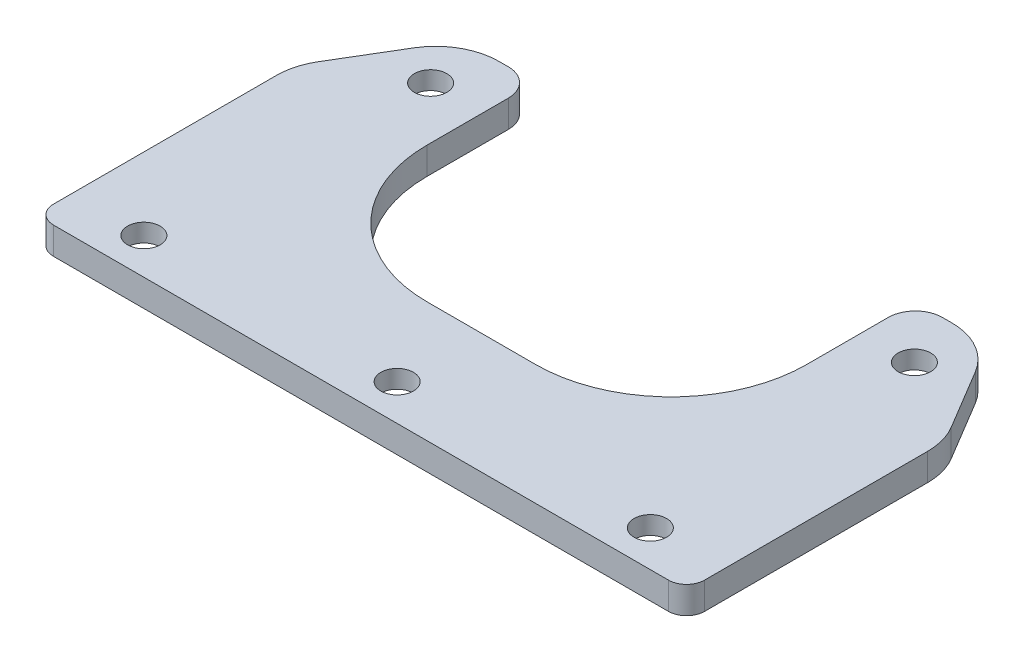
ISO-10303-21;
HEADER;
FILE_DESCRIPTION(('STEP AP214'),'2;1');
FILE_NAME('part.step','',(''),(''),'','','');
FILE_SCHEMA(('AUTOMOTIVE_DESIGN { 1 0 10303 214 1 1 1 1 }'));
ENDSEC;
DATA;
#1=APPLICATION_CONTEXT('core data for automotive mechanical design processes');
#2=APPLICATION_PROTOCOL_DEFINITION('international standard','automotive_design',2000,#1);
#3=PRODUCT_CONTEXT('',#1,'mechanical');
#4=PRODUCT('Part','Part','',(#3));
#5=PRODUCT_RELATED_PRODUCT_CATEGORY('part','',(#4));
#6=PRODUCT_DEFINITION_FORMATION('','',#4);
#7=PRODUCT_DEFINITION_CONTEXT('part definition',#1,'design');
#8=PRODUCT_DEFINITION('design','',#6,#7);
#9=PRODUCT_DEFINITION_SHAPE('','',#8);
#10=(LENGTH_UNIT() NAMED_UNIT(*) SI_UNIT(.MILLI.,.METRE.));
#11=(NAMED_UNIT(*) PLANE_ANGLE_UNIT() SI_UNIT($,.RADIAN.));
#12=(NAMED_UNIT(*) SI_UNIT($,.STERADIAN.) SOLID_ANGLE_UNIT());
#13=UNCERTAINTY_MEASURE_WITH_UNIT(LENGTH_MEASURE(1.E-05),#10,'distance_accuracy_value','');
#14=(GEOMETRIC_REPRESENTATION_CONTEXT(3) GLOBAL_UNCERTAINTY_ASSIGNED_CONTEXT((#13)) GLOBAL_UNIT_ASSIGNED_CONTEXT((#10,
#11,#12)) REPRESENTATION_CONTEXT('',''));
#15=CARTESIAN_POINT('',(0.,0.,0.));
#16=DIRECTION('',(0.,0.,1.));
#17=DIRECTION('',(1.,0.,0.));
#18=AXIS2_PLACEMENT_3D('',#15,#16,#17);
#19=CARTESIAN_POINT('',(-242.879921715151,3.,-77.4282939240285));
#20=DIRECTION('',(0.,-1.,0.));
#21=DIRECTION('',(0.,0.,-1.));
#22=AXIS2_PLACEMENT_3D('',#19,#20,#21);
#23=CYLINDRICAL_SURFACE('',#22,1.80000000000001);
#24=CARTESIAN_POINT('',(-242.879921715151,-22.,-77.4282939240285));
#25=DIRECTION('',(0.,-1.,0.));
#26=DIRECTION('',(0.,0.,-1.));
#27=AXIS2_PLACEMENT_3D('',#24,#25,#26);
#28=CIRCLE('',#27,1.80000000000001);
#29=CARTESIAN_POINT('',(-242.879921715151,-22.,-79.2282939240285));
#30=VERTEX_POINT('',#29);
#31=EDGE_CURVE('E40',#30,#30,#28,.T.);
#32=ORIENTED_EDGE('',*,*,#31,.T.);
#33=EDGE_LOOP('',(#32));
#34=FACE_BOUND('',#33,.T.);
#35=CARTESIAN_POINT('',(-242.879921715151,-20.,-77.4282939240285));
#36=DIRECTION('',(0.,1.,0.));
#37=DIRECTION('',(0.,0.,1.));
#38=AXIS2_PLACEMENT_3D('',#35,#36,#37);
#39=CIRCLE('',#38,1.80000000000001);
#40=CARTESIAN_POINT('',(-242.879921715151,-20.,-75.6282939240285));
#41=VERTEX_POINT('',#40);
#42=EDGE_CURVE('E440',#41,#41,#39,.T.);
#43=ORIENTED_EDGE('',*,*,#42,.T.);
#44=EDGE_LOOP('',(#43));
#45=FACE_BOUND('',#44,.T.);
#46=ADVANCED_FACE('F36',(#34,#45),#23,.F.);
#47=CARTESIAN_POINT('',(-270.879921715153,3.,-77.4282939240285));
#48=DIRECTION('',(0.,-1.,0.));
#49=DIRECTION('',(0.,0.,-1.));
#50=AXIS2_PLACEMENT_3D('',#47,#48,#49);
#51=CYLINDRICAL_SURFACE('',#50,1.80000000000001);
#52=CARTESIAN_POINT('',(-270.879921715153,-22.,-77.4282939240285));
#53=DIRECTION('',(0.,-1.,0.));
#54=DIRECTION('',(0.,0.,-1.));
#55=AXIS2_PLACEMENT_3D('',#52,#53,#54);
#56=CIRCLE('',#55,1.80000000000001);
#57=CARTESIAN_POINT('',(-270.879921715153,-22.,-79.2282939240285));
#58=VERTEX_POINT('',#57);
#59=EDGE_CURVE('E239',#58,#58,#56,.T.);
#60=ORIENTED_EDGE('',*,*,#59,.T.);
#61=EDGE_LOOP('',(#60));
#62=FACE_BOUND('',#61,.T.);
#63=CARTESIAN_POINT('',(-270.879921715153,-20.,-77.4282939240285));
#64=DIRECTION('',(0.,1.,0.));
#65=DIRECTION('',(0.,0.,1.));
#66=AXIS2_PLACEMENT_3D('',#63,#64,#65);
#67=CIRCLE('',#66,1.80000000000001);
#68=CARTESIAN_POINT('',(-270.879921715153,-20.,-75.6282939240285));
#69=VERTEX_POINT('',#68);
#70=EDGE_CURVE('E437',#69,#69,#67,.T.);
#71=ORIENTED_EDGE('',*,*,#70,.T.);
#72=EDGE_LOOP('',(#71));
#73=FACE_BOUND('',#72,.T.);
#74=ADVANCED_FACE('F482',(#62,#73),#51,.F.);
#75=CARTESIAN_POINT('',(-216.129921715153,3.,-107.878293924028));
#76=DIRECTION('',(0.,-1.,0.));
#77=DIRECTION('',(0.,0.,-1.));
#78=AXIS2_PLACEMENT_3D('',#75,#76,#77);
#79=CYLINDRICAL_SURFACE('',#78,1.80000000000001);
#80=CARTESIAN_POINT('',(-216.129921715153,-22.,-107.878293924028));
#81=DIRECTION('',(0.,-1.,0.));
#82=DIRECTION('',(0.,0.,-1.));
#83=AXIS2_PLACEMENT_3D('',#80,#81,#82);
#84=CIRCLE('',#83,1.80000000000001);
#85=CARTESIAN_POINT('',(-216.129921715153,-22.,-109.678293924028));
#86=VERTEX_POINT('',#85);
#87=EDGE_CURVE('E236',#86,#86,#84,.F.);
#88=ORIENTED_EDGE('',*,*,#87,.F.);
#89=EDGE_LOOP('',(#88));
#90=FACE_BOUND('',#89,.T.);
#91=CARTESIAN_POINT('',(-216.129921715153,-20.,-107.878293924028));
#92=DIRECTION('',(0.,1.,0.));
#93=DIRECTION('',(0.,0.,1.));
#94=AXIS2_PLACEMENT_3D('',#91,#92,#93);
#95=CIRCLE('',#94,1.80000000000001);
#96=CARTESIAN_POINT('',(-216.129921715153,-20.,-106.078293924028));
#97=VERTEX_POINT('',#96);
#98=EDGE_CURVE('E434',#97,#97,#95,.F.);
#99=ORIENTED_EDGE('',*,*,#98,.F.);
#100=EDGE_LOOP('',(#99));
#101=FACE_BOUND('',#100,.T.);
#102=ADVANCED_FACE('F487',(#90,#101),#79,.F.);
#103=CARTESIAN_POINT('',(-214.879921715153,3.,-77.4282939240285));
#104=DIRECTION('',(0.,-1.,0.));
#105=DIRECTION('',(0.,0.,-1.));
#106=AXIS2_PLACEMENT_3D('',#103,#104,#105);
#107=CYLINDRICAL_SURFACE('',#106,1.80000000000001);
#108=CARTESIAN_POINT('',(-214.879921715153,-22.,-77.4282939240285));
#109=DIRECTION('',(0.,-1.,0.));
#110=DIRECTION('',(0.,0.,-1.));
#111=AXIS2_PLACEMENT_3D('',#108,#109,#110);
#112=CIRCLE('',#111,1.80000000000001);
#113=CARTESIAN_POINT('',(-214.879921715153,-22.,-79.2282939240285));
#114=VERTEX_POINT('',#113);
#115=EDGE_CURVE('E233',#114,#114,#112,.F.);
#116=ORIENTED_EDGE('',*,*,#115,.F.);
#117=EDGE_LOOP('',(#116));
#118=FACE_BOUND('',#117,.T.);
#119=CARTESIAN_POINT('',(-214.879921715153,-20.,-77.4282939240285));
#120=DIRECTION('',(0.,1.,0.));
#121=DIRECTION('',(0.,0.,1.));
#122=AXIS2_PLACEMENT_3D('',#119,#120,#121);
#123=CIRCLE('',#122,1.80000000000001);
#124=CARTESIAN_POINT('',(-214.879921715153,-20.,-75.6282939240285));
#125=VERTEX_POINT('',#124);
#126=EDGE_CURVE('E431',#125,#125,#123,.F.);
#127=ORIENTED_EDGE('',*,*,#126,.F.);
#128=EDGE_LOOP('',(#127));
#129=FACE_BOUND('',#128,.T.);
#130=ADVANCED_FACE('F491',(#118,#129),#107,.F.);
#131=CARTESIAN_POINT('',(-269.629921715153,3.,-107.878293924028));
#132=DIRECTION('',(0.,-1.,0.));
#133=DIRECTION('',(0.,0.,-1.));
#134=AXIS2_PLACEMENT_3D('',#131,#132,#133);
#135=CYLINDRICAL_SURFACE('',#134,1.80000000000001);
#136=CARTESIAN_POINT('',(-269.629921715153,-22.,-107.878293924028));
#137=DIRECTION('',(0.,-1.,0.));
#138=DIRECTION('',(0.,0.,-1.));
#139=AXIS2_PLACEMENT_3D('',#136,#137,#138);
#140=CIRCLE('',#139,1.80000000000001);
#141=CARTESIAN_POINT('',(-269.629921715153,-22.,-109.678293924028));
#142=VERTEX_POINT('',#141);
#143=EDGE_CURVE('E228',#142,#142,#140,.T.);
#144=ORIENTED_EDGE('',*,*,#143,.T.);
#145=EDGE_LOOP('',(#144));
#146=FACE_BOUND('',#145,.T.);
#147=CARTESIAN_POINT('',(-269.629921715153,-20.,-107.878293924028));
#148=DIRECTION('',(0.,1.,0.));
#149=DIRECTION('',(0.,0.,1.));
#150=AXIS2_PLACEMENT_3D('',#147,#148,#149);
#151=CIRCLE('',#150,1.80000000000001);
#152=CARTESIAN_POINT('',(-269.629921715153,-20.,-106.078293924028));
#153=VERTEX_POINT('',#152);
#154=EDGE_CURVE('E428',#153,#153,#151,.T.);
#155=ORIENTED_EDGE('',*,*,#154,.T.);
#156=EDGE_LOOP('',(#155));
#157=FACE_BOUND('',#156,.T.);
#158=ADVANCED_FACE('F497',(#146,#157),#135,.F.);
#159=CARTESIAN_POINT('',(-250.320026660747,3.,-149.764118514967));
#160=DIRECTION('',(0.858139411304156,0.,0.51341674180587));
#161=DIRECTION('',(0.51341674180587,0.,-0.858139411304157));
#162=AXIS2_PLACEMENT_3D('',#159,#160,#161);
#163=PLANE('',#162);
#164=DIRECTION('',(-0.51341674180587,0.,0.858139411304157));
#165=VECTOR('',#164,1.);
#166=CARTESIAN_POINT('',(-250.320026660747,-20.,-149.764118514967));
#167=LINE('',#166,#165);
#168=CARTESIAN_POINT('',(-273.917749035795,-20.,-110.322211116669));
#169=VERTEX_POINT('',#168);
#170=CARTESIAN_POINT('',(-277.886897594282,-20.,-103.688062811769));
#171=VERTEX_POINT('',#170);
#172=EDGE_CURVE('E415',#169,#171,#167,.T.);
#173=ORIENTED_EDGE('',*,*,#172,.F.);
#174=DIRECTION('',(0.,-1.,0.));
#175=VECTOR('',#174,1.);
#176=CARTESIAN_POINT('',(-273.917749035795,3.,-110.322211116669));
#177=LINE('',#176,#175);
#178=CARTESIAN_POINT('',(-273.917749035795,-23.,-110.322211116669));
#179=VERTEX_POINT('',#178);
#180=EDGE_CURVE('E307',#169,#179,#177,.T.);
#181=ORIENTED_EDGE('',*,*,#180,.T.);
#182=DIRECTION('',(0.51341674180587,0.,-0.858139411304156));
#183=VECTOR('',#182,1.);
#184=CARTESIAN_POINT('',(-278.879921715153,-23.,-102.028293924028));
#185=LINE('',#184,#183);
#186=CARTESIAN_POINT('',(-277.886897594282,-23.,-103.688062811769));
#187=VERTEX_POINT('',#186);
#188=EDGE_CURVE('E261',#187,#179,#185,.T.);
#189=ORIENTED_EDGE('',*,*,#188,.F.);
#190=DIRECTION('',(0.,1.,0.));
#191=VECTOR('',#190,1.);
#192=CARTESIAN_POINT('',(-277.886897594282,3.,-103.688062811769));
#193=LINE('',#192,#191);
#194=EDGE_CURVE('E304',#187,#171,#193,.T.);
#195=ORIENTED_EDGE('',*,*,#194,.T.);
#196=EDGE_LOOP('',(#173,#181,#189,#195));
#197=FACE_BOUND('',#196,.T.);
#198=ADVANCED_FACE('F412',(#197),#163,.F.);
#199=CARTESIAN_POINT('',(-278.879921715153,3.,0.));
#200=DIRECTION('',(1.,0.,0.));
#201=DIRECTION('',(0.,0.,-1.));
#202=AXIS2_PLACEMENT_3D('',#199,#200,#201);
#203=PLANE('',#202);
#204=DIRECTION('',(0.,-1.,0.));
#205=VECTOR('',#204,1.);
#206=CARTESIAN_POINT('',(-278.879921715153,3.,-75.4282939240285));
#207=LINE('',#206,#205);
#208=CARTESIAN_POINT('',(-278.879921715153,-23.,-75.4282939240285));
#209=VERTEX_POINT('',#208);
#210=CARTESIAN_POINT('',(-278.879921715153,-20.,-75.4282939240285));
#211=VERTEX_POINT('',#210);
#212=EDGE_CURVE('E221',#209,#211,#207,.F.);
#213=ORIENTED_EDGE('',*,*,#212,.T.);
#214=DIRECTION('',(0.,0.,-1.));
#215=VECTOR('',#214,1.);
#216=CARTESIAN_POINT('',(-278.879921715153,-20.,-81.4282939240285));
#217=LINE('',#216,#215);
#218=CARTESIAN_POINT('',(-278.879921715153,-20.,-100.094145619128));
#219=VERTEX_POINT('',#218);
#220=EDGE_CURVE('E284',#211,#219,#217,.T.);
#221=ORIENTED_EDGE('',*,*,#220,.T.);
#222=DIRECTION('',(0.,1.,0.));
#223=VECTOR('',#222,1.);
#224=CARTESIAN_POINT('',(-278.879921715153,3.,-100.094145619128));
#225=LINE('',#224,#223);
#226=CARTESIAN_POINT('',(-278.879921715153,-23.,-100.094145619128));
#227=VERTEX_POINT('',#226);
#228=EDGE_CURVE('E334',#219,#227,#225,.F.);
#229=ORIENTED_EDGE('',*,*,#228,.T.);
#230=DIRECTION('',(0.,0.,-1.));
#231=VECTOR('',#230,1.);
#232=CARTESIAN_POINT('',(-278.879921715153,-23.,-73.4282939240285));
#233=LINE('',#232,#231);
#234=EDGE_CURVE('E259',#209,#227,#233,.T.);
#235=ORIENTED_EDGE('',*,*,#234,.F.);
#236=EDGE_LOOP('',(#213,#221,#229,#235));
#237=FACE_BOUND('',#236,.T.);
#238=ADVANCED_FACE('F404',(#237),#203,.F.);
#239=CARTESIAN_POINT('',(0.,3.,-73.4282939240286));
#240=DIRECTION('',(0.,0.,-1.));
#241=DIRECTION('',(-1.,0.,0.));
#242=AXIS2_PLACEMENT_3D('',#239,#240,#241);
#243=PLANE('',#242);
#244=DIRECTION('',(1.,0.,0.));
#245=VECTOR('',#244,1.);
#246=CARTESIAN_POINT('',(0.,-20.,-73.4282939240286));
#247=LINE('',#246,#245);
#248=CARTESIAN_POINT('',(-276.879921715153,-20.,-73.4282939240285));
#249=VERTEX_POINT('',#248);
#250=CARTESIAN_POINT('',(-208.879921715153,-20.,-73.4282939240285));
#251=VERTEX_POINT('',#250);
#252=EDGE_CURVE('E53',#249,#251,#247,.T.);
#253=ORIENTED_EDGE('',*,*,#252,.F.);
#254=DIRECTION('',(0.,-1.,0.));
#255=VECTOR('',#254,1.);
#256=CARTESIAN_POINT('',(-276.879921715153,3.,-73.4282939240285));
#257=LINE('',#256,#255);
#258=CARTESIAN_POINT('',(-276.879921715153,-23.,-73.4282939240285));
#259=VERTEX_POINT('',#258);
#260=EDGE_CURVE('E216',#249,#259,#257,.T.);
#261=ORIENTED_EDGE('',*,*,#260,.T.);
#262=DIRECTION('',(-1.,0.,0.));
#263=VECTOR('',#262,1.);
#264=CARTESIAN_POINT('',(-206.879921715153,-23.,-73.4282939240285));
#265=LINE('',#264,#263);
#266=CARTESIAN_POINT('',(-208.879921715153,-23.,-73.4282939240285));
#267=VERTEX_POINT('',#266);
#268=EDGE_CURVE('E257',#267,#259,#265,.T.);
#269=ORIENTED_EDGE('',*,*,#268,.F.);
#270=DIRECTION('',(0.,-1.,0.));
#271=VECTOR('',#270,1.);
#272=CARTESIAN_POINT('',(-208.879921715153,3.,-73.4282939240285));
#273=LINE('',#272,#271);
#274=EDGE_CURVE('E213',#267,#251,#273,.F.);
#275=ORIENTED_EDGE('',*,*,#274,.T.);
#276=EDGE_LOOP('',(#253,#261,#269,#275));
#277=FACE_BOUND('',#276,.T.);
#278=ADVANCED_FACE('F396',(#277),#243,.F.);
#279=CARTESIAN_POINT('',(-206.879921715153,3.,0.));
#280=DIRECTION('',(1.,0.,0.));
#281=DIRECTION('',(0.,0.,-1.));
#282=AXIS2_PLACEMENT_3D('',#279,#280,#281);
#283=PLANE('',#282);
#284=DIRECTION('',(0.,0.,1.));
#285=VECTOR('',#284,1.);
#286=CARTESIAN_POINT('',(-206.879921715153,-20.,-81.4282939240285));
#287=LINE('',#286,#285);
#288=CARTESIAN_POINT('',(-206.879921715153,-20.,-100.094145619128));
#289=VERTEX_POINT('',#288);
#290=CARTESIAN_POINT('',(-206.879921715153,-20.,-75.4282939240285));
#291=VERTEX_POINT('',#290);
#292=EDGE_CURVE('E231',#289,#291,#287,.T.);
#293=ORIENTED_EDGE('',*,*,#292,.T.);
#294=DIRECTION('',(0.,-1.,0.));
#295=VECTOR('',#294,1.);
#296=CARTESIAN_POINT('',(-206.879921715153,-23.,-75.4282939240285));
#297=LINE('',#296,#295);
#298=CARTESIAN_POINT('',(-206.879921715153,-23.,-75.4282939240285));
#299=VERTEX_POINT('',#298);
#300=EDGE_CURVE('E224',#291,#299,#297,.T.);
#301=ORIENTED_EDGE('',*,*,#300,.T.);
#302=DIRECTION('',(0.,0.,1.));
#303=VECTOR('',#302,1.);
#304=CARTESIAN_POINT('',(-206.879921715153,-23.,-81.4282939240285));
#305=LINE('',#304,#303);
#306=CARTESIAN_POINT('',(-206.879921715153,-23.,-100.094145619128));
#307=VERTEX_POINT('',#306);
#308=EDGE_CURVE('E186',#307,#299,#305,.T.);
#309=ORIENTED_EDGE('',*,*,#308,.F.);
#310=DIRECTION('',(0.,1.,0.));
#311=VECTOR('',#310,1.);
#312=CARTESIAN_POINT('',(-206.879921715153,3.,-100.094145619128));
#313=LINE('',#312,#311);
#314=EDGE_CURVE('E327',#307,#289,#313,.T.);
#315=ORIENTED_EDGE('',*,*,#314,.T.);
#316=EDGE_LOOP('',(#293,#301,#309,#315));
#317=FACE_BOUND('',#316,.T.);
#318=ADVANCED_FACE('F388',(#317),#283,.T.);
#319=CARTESIAN_POINT('',(-107.39510038846,3.,64.2534788648857));
#320=DIRECTION('',(0.858139411304158,0.,-0.513416741805868));
#321=DIRECTION('',(-0.513416741805868,0.,-0.858139411304158));
#322=AXIS2_PLACEMENT_3D('',#319,#320,#321);
#323=PLANE('',#322);
#324=DIRECTION('',(0.,-1.,0.));
#325=VECTOR('',#324,1.);
#326=CARTESIAN_POINT('',(-211.842094394513,3.,-110.322211116674));
#327=LINE('',#326,#325);
#328=CARTESIAN_POINT('',(-211.842094394513,-23.,-110.322211116674));
#329=VERTEX_POINT('',#328);
#330=CARTESIAN_POINT('',(-211.842094394513,-20.,-110.322211116674));
#331=VERTEX_POINT('',#330);
#332=EDGE_CURVE('E324',#329,#331,#327,.F.);
#333=ORIENTED_EDGE('',*,*,#332,.T.);
#334=DIRECTION('',(0.513416741805868,0.,0.858139411304158));
#335=VECTOR('',#334,1.);
#336=CARTESIAN_POINT('',(-107.39510038846,-20.,64.2534788648857));
#337=LINE('',#336,#335);
#338=CARTESIAN_POINT('',(-207.872945836024,-20.,-103.688062811769));
#339=VERTEX_POINT('',#338);
#340=EDGE_CURVE('E382',#331,#339,#337,.T.);
#341=ORIENTED_EDGE('',*,*,#340,.T.);
#342=DIRECTION('',(0.,1.,0.));
#343=VECTOR('',#342,1.);
#344=CARTESIAN_POINT('',(-207.872945836024,3.,-103.688062811769));
#345=LINE('',#344,#343);
#346=CARTESIAN_POINT('',(-207.872945836024,-23.,-103.688062811769));
#347=VERTEX_POINT('',#346);
#348=EDGE_CURVE('E322',#339,#347,#345,.F.);
#349=ORIENTED_EDGE('',*,*,#348,.T.);
#350=DIRECTION('',(0.513416741805867,0.,0.858139411304158));
#351=VECTOR('',#350,1.);
#352=CARTESIAN_POINT('',(-213.879921715153,-23.,-113.728293924029));
#353=LINE('',#352,#351);
#354=EDGE_CURVE('E280',#329,#347,#353,.T.);
#355=ORIENTED_EDGE('',*,*,#354,.F.);
#356=EDGE_LOOP('',(#333,#341,#349,#355));
#357=FACE_BOUND('',#356,.T.);
#358=ADVANCED_FACE('F379',(#357),#323,.T.);
#359=CARTESIAN_POINT('',(-1.00710388347737E-11,3.,-113.728293924052));
#360=DIRECTION('',(0.,0.,1.));
#361=DIRECTION('',(1.,0.,0.));
#362=AXIS2_PLACEMENT_3D('',#359,#360,#361);
#363=PLANE('',#362);
#364=DIRECTION('',(-1.,0.,0.));
#365=VECTOR('',#364,1.);
#366=CARTESIAN_POINT('',(-1.00710388347737E-11,-20.,-113.728293924052));
#367=LINE('',#366,#365);
#368=CARTESIAN_POINT('',(-217.849070273643,-20.,-113.728293924033));
#369=VERTEX_POINT('',#368);
#370=CARTESIAN_POINT('',(-218.879921715153,-20.,-113.728293924033));
#371=VERTEX_POINT('',#370);
#372=EDGE_CURVE('E194',#369,#371,#367,.T.);
#373=ORIENTED_EDGE('',*,*,#372,.F.);
#374=DIRECTION('',(0.,-1.,0.));
#375=VECTOR('',#374,1.);
#376=CARTESIAN_POINT('',(-217.849070273643,-23.,-113.728293924033));
#377=LINE('',#376,#375);
#378=CARTESIAN_POINT('',(-217.849070273643,-23.,-113.72829392403));
#379=VERTEX_POINT('',#378);
#380=EDGE_CURVE('E317',#369,#379,#377,.T.);
#381=ORIENTED_EDGE('',*,*,#380,.T.);
#382=DIRECTION('',(1.,0.,4.64905891561784E-13));
#383=VECTOR('',#382,1.);
#384=CARTESIAN_POINT('',(-221.879921715153,-23.,-113.728293924032));
#385=LINE('',#384,#383);
#386=CARTESIAN_POINT('',(-218.879921715153,-23.,-113.728293924031));
#387=VERTEX_POINT('',#386);
#388=EDGE_CURVE('E277',#387,#379,#385,.T.);
#389=ORIENTED_EDGE('',*,*,#388,.F.);
#390=DIRECTION('',(0.,1.,0.));
#391=VECTOR('',#390,1.);
#392=CARTESIAN_POINT('',(-218.879921715153,-13.,-113.728293924033));
#393=LINE('',#392,#391);
#394=EDGE_CURVE('E202',#387,#371,#393,.T.);
#395=ORIENTED_EDGE('',*,*,#394,.T.);
#396=EDGE_LOOP('',(#373,#381,#389,#395));
#397=FACE_BOUND('',#396,.T.);
#398=ADVANCED_FACE('F369',(#397),#363,.F.);
#399=CARTESIAN_POINT('',(-266.879921715153,-20.,-113.728293924028));
#400=VERTEX_POINT('',#399);
#401=CARTESIAN_POINT('',(-267.910773156666,-20.,-113.728293924028));
#402=VERTEX_POINT('',#401);
#403=EDGE_CURVE('E342',#400,#402,#367,.T.);
#404=ORIENTED_EDGE('',*,*,#403,.F.);
#405=DIRECTION('',(0.,1.,0.));
#406=VECTOR('',#405,1.);
#407=CARTESIAN_POINT('',(-266.879921715153,3.,-113.728293924028));
#408=LINE('',#407,#406);
#409=CARTESIAN_POINT('',(-266.879921715153,-23.,-113.728293924029));
#410=VERTEX_POINT('',#409);
#411=EDGE_CURVE('E205',#400,#410,#408,.F.);
#412=ORIENTED_EDGE('',*,*,#411,.T.);
#413=DIRECTION('',(1.,0.,0.));
#414=VECTOR('',#413,1.);
#415=CARTESIAN_POINT('',(-271.879921715153,-23.,-113.728293924029));
#416=LINE('',#415,#414);
#417=CARTESIAN_POINT('',(-267.910773156666,-23.,-113.728293924029));
#418=VERTEX_POINT('',#417);
#419=EDGE_CURVE('E264',#418,#410,#416,.T.);
#420=ORIENTED_EDGE('',*,*,#419,.F.);
#421=DIRECTION('',(0.,-1.,0.));
#422=VECTOR('',#421,1.);
#423=CARTESIAN_POINT('',(-267.910773156666,3.,-113.728293924028));
#424=LINE('',#423,#422);
#425=EDGE_CURVE('E319',#418,#402,#424,.F.);
#426=ORIENTED_EDGE('',*,*,#425,.T.);
#427=EDGE_LOOP('',(#404,#412,#420,#426));
#428=FACE_BOUND('',#427,.T.);
#429=ADVANCED_FACE('F340',(#428),#363,.F.);
#430=CARTESIAN_POINT('',(-267.910773156666,3.,-106.728293924028));
#431=DIRECTION('',(0.,-1.,0.));
#432=DIRECTION('',(0.,0.,-1.));
#433=AXIS2_PLACEMENT_3D('',#430,#431,#432);
#434=CYLINDRICAL_SURFACE('',#433,7.);
#435=ORIENTED_EDGE('',*,*,#180,.F.);
#436=CARTESIAN_POINT('',(-267.910773156666,-20.,-106.728293924028));
#437=DIRECTION('',(0.,1.,0.));
#438=DIRECTION('',(0.,0.,1.));
#439=AXIS2_PLACEMENT_3D('',#436,#437,#438);
#440=CIRCLE('',#439,7.);
#441=EDGE_CURVE('E417',#169,#402,#440,.F.);
#442=ORIENTED_EDGE('',*,*,#441,.T.);
#443=ORIENTED_EDGE('',*,*,#425,.F.);
#444=CARTESIAN_POINT('',(-267.910773156666,-23.,-106.728293924028));
#445=DIRECTION('',(0.,-1.,0.));
#446=DIRECTION('',(0.,0.,-1.));
#447=AXIS2_PLACEMENT_3D('',#444,#445,#446);
#448=CIRCLE('',#447,7.);
#449=EDGE_CURVE('E315',#179,#418,#448,.T.);
#450=ORIENTED_EDGE('',*,*,#449,.F.);
#451=EDGE_LOOP('',(#435,#442,#443,#450));
#452=FACE_BOUND('',#451,.T.);
#453=ADVANCED_FACE('F513',(#452),#434,.T.);
#454=CARTESIAN_POINT('',(-217.849070273642,3.,-106.728293924033));
#455=DIRECTION('',(0.,1.,0.));
#456=DIRECTION('',(0.,0.,1.));
#457=AXIS2_PLACEMENT_3D('',#454,#455,#456);
#458=CYLINDRICAL_SURFACE('',#457,7.);
#459=ORIENTED_EDGE('',*,*,#380,.F.);
#460=CARTESIAN_POINT('',(-217.849070273642,-20.,-106.728293924033));
#461=DIRECTION('',(0.,1.,0.));
#462=DIRECTION('',(0.,0.,1.));
#463=AXIS2_PLACEMENT_3D('',#460,#461,#462);
#464=CIRCLE('',#463,7.);
#465=EDGE_CURVE('E375',#369,#331,#464,.F.);
#466=ORIENTED_EDGE('',*,*,#465,.T.);
#467=ORIENTED_EDGE('',*,*,#332,.F.);
#468=CARTESIAN_POINT('',(-217.849070273642,-23.,-106.728293924033));
#469=DIRECTION('',(0.,-1.,0.));
#470=DIRECTION('',(0.,0.,-1.));
#471=AXIS2_PLACEMENT_3D('',#468,#469,#470);
#472=CIRCLE('',#471,7.);
#473=EDGE_CURVE('E313',#379,#329,#472,.T.);
#474=ORIENTED_EDGE('',*,*,#473,.F.);
#475=EDGE_LOOP('',(#459,#466,#467,#474));
#476=FACE_BOUND('',#475,.T.);
#477=ADVANCED_FACE('F373',(#476),#458,.T.);
#478=CARTESIAN_POINT('',(-213.879921715153,3.,-100.094145619128));
#479=DIRECTION('',(0.,1.,0.));
#480=DIRECTION('',(0.,0.,1.));
#481=AXIS2_PLACEMENT_3D('',#478,#479,#480);
#482=CYLINDRICAL_SURFACE('',#481,7.);
#483=ORIENTED_EDGE('',*,*,#348,.F.);
#484=CARTESIAN_POINT('',(-213.879921715153,-20.,-100.094145619128));
#485=DIRECTION('',(0.,-1.,0.));
#486=DIRECTION('',(0.,0.,-1.));
#487=AXIS2_PLACEMENT_3D('',#484,#485,#486);
#488=CIRCLE('',#487,7.);
#489=EDGE_CURVE('E332',#289,#339,#488,.F.);
#490=ORIENTED_EDGE('',*,*,#489,.F.);
#491=ORIENTED_EDGE('',*,*,#314,.F.);
#492=CARTESIAN_POINT('',(-213.879921715153,-23.,-100.094145619128));
#493=DIRECTION('',(0.,-1.,0.));
#494=DIRECTION('',(0.,0.,-1.));
#495=AXIS2_PLACEMENT_3D('',#492,#493,#494);
#496=CIRCLE('',#495,7.);
#497=EDGE_CURVE('E311',#347,#307,#496,.T.);
#498=ORIENTED_EDGE('',*,*,#497,.F.);
#499=EDGE_LOOP('',(#483,#490,#491,#498));
#500=FACE_BOUND('',#499,.T.);
#501=ADVANCED_FACE('F384',(#500),#482,.T.);
#502=CARTESIAN_POINT('',(-271.879921715153,3.,-100.094145619128));
#503=DIRECTION('',(0.,1.,0.));
#504=DIRECTION('',(0.,0.,1.));
#505=AXIS2_PLACEMENT_3D('',#502,#503,#504);
#506=CYLINDRICAL_SURFACE('',#505,7.);
#507=CARTESIAN_POINT('',(-271.879921715153,-20.,-100.094145619128));
#508=DIRECTION('',(0.,-1.,0.));
#509=DIRECTION('',(0.,0.,-1.));
#510=AXIS2_PLACEMENT_3D('',#507,#508,#509);
#511=CIRCLE('',#510,7.);
#512=EDGE_CURVE('E330',#171,#219,#511,.F.);
#513=ORIENTED_EDGE('',*,*,#512,.F.);
#514=ORIENTED_EDGE('',*,*,#194,.F.);
#515=CARTESIAN_POINT('',(-271.879921715153,-23.,-100.094145619128));
#516=DIRECTION('',(0.,-1.,0.));
#517=DIRECTION('',(0.,0.,-1.));
#518=AXIS2_PLACEMENT_3D('',#515,#516,#517);
#519=CIRCLE('',#518,7.);
#520=EDGE_CURVE('E309',#227,#187,#519,.T.);
#521=ORIENTED_EDGE('',*,*,#520,.F.);
#522=ORIENTED_EDGE('',*,*,#228,.F.);
#523=EDGE_LOOP('',(#513,#514,#521,#522));
#524=FACE_BOUND('',#523,.T.);
#525=ADVANCED_FACE('F414',(#524),#506,.T.);
#526=CARTESIAN_POINT('',(-218.879921715153,3.,-110.728293924033));
#527=DIRECTION('',(0.,-1.,0.));
#528=DIRECTION('',(0.,0.,-1.));
#529=AXIS2_PLACEMENT_3D('',#526,#527,#528);
#530=CYLINDRICAL_SURFACE('',#529,3.);
#531=CARTESIAN_POINT('',(-218.879921715153,-20.,-110.728293924033));
#532=DIRECTION('',(0.,1.,0.));
#533=DIRECTION('',(0.,0.,1.));
#534=AXIS2_PLACEMENT_3D('',#531,#532,#533);
#535=CIRCLE('',#534,3.);
#536=CARTESIAN_POINT('',(-221.879921715153,-20.,-110.728293924033));
#537=VERTEX_POINT('',#536);
#538=EDGE_CURVE('E11',#537,#371,#535,.F.);
#539=ORIENTED_EDGE('',*,*,#538,.T.);
#540=ORIENTED_EDGE('',*,*,#394,.F.);
#541=CARTESIAN_POINT('',(-218.879921715153,-23.,-110.728293924033));
#542=DIRECTION('',(0.,-1.,0.));
#543=DIRECTION('',(0.,0.,-1.));
#544=AXIS2_PLACEMENT_3D('',#541,#542,#543);
#545=CIRCLE('',#544,3.);
#546=CARTESIAN_POINT('',(-221.879921715153,-23.,-110.728293924033));
#547=VERTEX_POINT('',#546);
#548=EDGE_CURVE('E200',#547,#387,#545,.T.);
#549=ORIENTED_EDGE('',*,*,#548,.F.);
#550=DIRECTION('',(0.,1.,0.));
#551=VECTOR('',#550,1.);
#552=CARTESIAN_POINT('',(-221.879921715153,-23.,-110.728293924033));
#553=LINE('',#552,#551);
#554=EDGE_CURVE('E180',#537,#547,#553,.F.);
#555=ORIENTED_EDGE('',*,*,#554,.F.);
#556=EDGE_LOOP('',(#539,#540,#549,#555));
#557=FACE_BOUND('',#556,.T.);
#558=ADVANCED_FACE('F199',(#557),#530,.T.);
#559=CARTESIAN_POINT('',(-266.879921715153,-20.,-110.728293924028));
#560=DIRECTION('',(0.,1.,0.));
#561=DIRECTION('',(0.,0.,1.));
#562=AXIS2_PLACEMENT_3D('',#559,#560,#561);
#563=CYLINDRICAL_SURFACE('',#562,3.);
#564=ORIENTED_EDGE('',*,*,#411,.F.);
#565=CARTESIAN_POINT('',(-266.879921715153,-20.0000000000001,-110.728293924028));
#566=DIRECTION('',(0.,1.,0.));
#567=DIRECTION('',(0.,0.,1.));
#568=AXIS2_PLACEMENT_3D('',#565,#566,#567);
#569=CIRCLE('',#568,3.);
#570=CARTESIAN_POINT('',(-263.879921715153,-20.,-110.728293924028));
#571=VERTEX_POINT('',#570);
#572=EDGE_CURVE('E45',#400,#571,#569,.F.);
#573=ORIENTED_EDGE('',*,*,#572,.T.);
#574=DIRECTION('',(0.,1.,0.));
#575=VECTOR('',#574,1.);
#576=CARTESIAN_POINT('',(-263.879921715153,-20.,-110.728293924028));
#577=LINE('',#576,#575);
#578=CARTESIAN_POINT('',(-263.879921715153,-23.,-110.728293924028));
#579=VERTEX_POINT('',#578);
#580=EDGE_CURVE('E210',#579,#571,#577,.T.);
#581=ORIENTED_EDGE('',*,*,#580,.F.);
#582=CARTESIAN_POINT('',(-266.879921715153,-23.,-110.728293924028));
#583=DIRECTION('',(0.,-1.,0.));
#584=DIRECTION('',(0.,0.,-1.));
#585=AXIS2_PLACEMENT_3D('',#582,#583,#584);
#586=CIRCLE('',#585,3.);
#587=EDGE_CURVE('E201',#410,#579,#586,.T.);
#588=ORIENTED_EDGE('',*,*,#587,.F.);
#589=EDGE_LOOP('',(#564,#573,#581,#588));
#590=FACE_BOUND('',#589,.T.);
#591=ADVANCED_FACE('F349',(#590),#563,.T.);
#592=CARTESIAN_POINT('',(-276.879921715153,3.,-75.4282939240285));
#593=DIRECTION('',(0.,-1.,0.));
#594=DIRECTION('',(0.,0.,-1.));
#595=AXIS2_PLACEMENT_3D('',#592,#593,#594);
#596=CYLINDRICAL_SURFACE('',#595,2.);
#597=ORIENTED_EDGE('',*,*,#260,.F.);
#598=CARTESIAN_POINT('',(-276.879921715153,-20.,-75.4282939240285));
#599=DIRECTION('',(0.,1.,0.));
#600=DIRECTION('',(0.,0.,1.));
#601=AXIS2_PLACEMENT_3D('',#598,#599,#600);
#602=CIRCLE('',#601,2.);
#603=EDGE_CURVE('E402',#249,#211,#602,.F.);
#604=ORIENTED_EDGE('',*,*,#603,.T.);
#605=ORIENTED_EDGE('',*,*,#212,.F.);
#606=CARTESIAN_POINT('',(-276.879921715153,-23.,-75.4282939240285));
#607=DIRECTION('',(0.,-1.,0.));
#608=DIRECTION('',(0.,0.,-1.));
#609=AXIS2_PLACEMENT_3D('',#606,#607,#608);
#610=CIRCLE('',#609,2.);
#611=EDGE_CURVE('E61',#259,#209,#610,.T.);
#612=ORIENTED_EDGE('',*,*,#611,.F.);
#613=EDGE_LOOP('',(#597,#604,#605,#612));
#614=FACE_BOUND('',#613,.T.);
#615=ADVANCED_FACE('F401',(#614),#596,.T.);
#616=CARTESIAN_POINT('',(-208.879921715153,3.,-75.4282939240285));
#617=DIRECTION('',(0.,1.,0.));
#618=DIRECTION('',(0.,0.,1.));
#619=AXIS2_PLACEMENT_3D('',#616,#617,#618);
#620=CYLINDRICAL_SURFACE('',#619,2.);
#621=ORIENTED_EDGE('',*,*,#300,.F.);
#622=CARTESIAN_POINT('',(-208.879921715153,-20.,-75.4282939240285));
#623=DIRECTION('',(0.,1.,0.));
#624=DIRECTION('',(0.,0.,1.));
#625=AXIS2_PLACEMENT_3D('',#622,#623,#624);
#626=CIRCLE('',#625,2.);
#627=EDGE_CURVE('E418',#291,#251,#626,.F.);
#628=ORIENTED_EDGE('',*,*,#627,.T.);
#629=ORIENTED_EDGE('',*,*,#274,.F.);
#630=CARTESIAN_POINT('',(-208.879921715153,-23.,-75.4282939240285));
#631=DIRECTION('',(0.,-1.,0.));
#632=DIRECTION('',(0.,0.,-1.));
#633=AXIS2_PLACEMENT_3D('',#630,#631,#632);
#634=CIRCLE('',#633,2.);
#635=EDGE_CURVE('E218',#299,#267,#634,.T.);
#636=ORIENTED_EDGE('',*,*,#635,.F.);
#637=EDGE_LOOP('',(#621,#628,#629,#636));
#638=FACE_BOUND('',#637,.T.);
#639=ADVANCED_FACE('F38',(#638),#620,.T.);
#640=CARTESIAN_POINT('',(-263.879921715153,-20.,0.));
#641=DIRECTION('',(-1.,0.,0.));
#642=DIRECTION('',(0.,0.,1.));
#643=AXIS2_PLACEMENT_3D('',#640,#641,#642);
#644=PLANE('',#643);
#645=ORIENTED_EDGE('',*,*,#580,.T.);
#646=DIRECTION('',(0.,0.,1.));
#647=VECTOR('',#646,1.);
#648=CARTESIAN_POINT('',(-263.879921715153,-20.,-102.028293924028));
#649=LINE('',#648,#647);
#650=CARTESIAN_POINT('',(-263.879921715153,-20.,-101.728293924029));
#651=VERTEX_POINT('',#650);
#652=EDGE_CURVE('E287',#571,#651,#649,.T.);
#653=ORIENTED_EDGE('',*,*,#652,.T.);
#654=DIRECTION('',(0.,1.,0.));
#655=VECTOR('',#654,1.);
#656=CARTESIAN_POINT('',(-263.879921715153,-23.,-101.728293924029));
#657=LINE('',#656,#655);
#658=CARTESIAN_POINT('',(-263.879921715153,-23.,-101.728293924029));
#659=VERTEX_POINT('',#658);
#660=EDGE_CURVE('E301',#659,#651,#657,.T.);
#661=ORIENTED_EDGE('',*,*,#660,.F.);
#662=DIRECTION('',(0.,0.,1.));
#663=VECTOR('',#662,1.);
#664=CARTESIAN_POINT('',(-263.879921715153,-23.,-113.728293924029));
#665=LINE('',#664,#663);
#666=EDGE_CURVE('E267',#579,#659,#665,.T.);
#667=ORIENTED_EDGE('',*,*,#666,.F.);
#668=EDGE_LOOP('',(#645,#653,#661,#667));
#669=FACE_BOUND('',#668,.T.);
#670=ADVANCED_FACE('F351',(#669),#644,.F.);
#671=CARTESIAN_POINT('',(-221.879921715153,-20.,0.));
#672=DIRECTION('',(-1.,0.,0.));
#673=DIRECTION('',(0.,0.,1.));
#674=AXIS2_PLACEMENT_3D('',#671,#672,#673);
#675=PLANE('',#674);
#676=DIRECTION('',(0.,0.,-1.));
#677=VECTOR('',#676,1.);
#678=CARTESIAN_POINT('',(-221.879921715153,-20.,-102.028293924028));
#679=LINE('',#678,#677);
#680=CARTESIAN_POINT('',(-221.879921715153,-20.,-101.728293924029));
#681=VERTEX_POINT('',#680);
#682=EDGE_CURVE('E175',#681,#537,#679,.T.);
#683=ORIENTED_EDGE('',*,*,#682,.T.);
#684=ORIENTED_EDGE('',*,*,#554,.T.);
#685=DIRECTION('',(0.,0.,-1.));
#686=VECTOR('',#685,1.);
#687=CARTESIAN_POINT('',(-221.879921715153,-23.,-102.028293924028));
#688=LINE('',#687,#686);
#689=CARTESIAN_POINT('',(-221.879921715153,-23.,-101.728293924029));
#690=VERTEX_POINT('',#689);
#691=EDGE_CURVE('E275',#690,#547,#688,.T.);
#692=ORIENTED_EDGE('',*,*,#691,.F.);
#693=DIRECTION('',(0.,1.,0.));
#694=VECTOR('',#693,1.);
#695=CARTESIAN_POINT('',(-221.879921715153,-23.,-101.728293924029));
#696=LINE('',#695,#694);
#697=EDGE_CURVE('E183',#690,#681,#696,.T.);
#698=ORIENTED_EDGE('',*,*,#697,.T.);
#699=EDGE_LOOP('',(#683,#684,#692,#698));
#700=FACE_BOUND('',#699,.T.);
#701=ADVANCED_FACE('F177',(#700),#675,.T.);
#702=CARTESIAN_POINT('',(-236.879921715153,-20.,-101.728293924029));
#703=DIRECTION('',(0.,-1.,0.));
#704=DIRECTION('',(0.,0.,-1.));
#705=AXIS2_PLACEMENT_3D('',#702,#703,#704);
#706=PLANE('',#705);
#707=ORIENTED_EDGE('',*,*,#172,.T.);
#708=ORIENTED_EDGE('',*,*,#512,.T.);
#709=ORIENTED_EDGE('',*,*,#220,.F.);
#710=ORIENTED_EDGE('',*,*,#603,.F.);
#711=ORIENTED_EDGE('',*,*,#252,.T.);
#712=ORIENTED_EDGE('',*,*,#627,.F.);
#713=ORIENTED_EDGE('',*,*,#292,.F.);
#714=ORIENTED_EDGE('',*,*,#489,.T.);
#715=ORIENTED_EDGE('',*,*,#340,.F.);
#716=ORIENTED_EDGE('',*,*,#465,.F.);
#717=ORIENTED_EDGE('',*,*,#372,.T.);
#718=ORIENTED_EDGE('',*,*,#538,.F.);
#719=ORIENTED_EDGE('',*,*,#682,.F.);
#720=CARTESIAN_POINT('',(-236.879921715153,-20.,-101.728293924029));
#721=DIRECTION('',(0.,1.,0.));
#722=DIRECTION('',(0.,0.,-1.));
#723=AXIS2_PLACEMENT_3D('',#720,#721,#722);
#724=CIRCLE('',#723,15.);
#725=CARTESIAN_POINT('',(-236.879921715153,-20.,-86.7282939240285));
#726=VERTEX_POINT('',#725);
#727=EDGE_CURVE('E187',#726,#681,#724,.T.);
#728=ORIENTED_EDGE('',*,*,#727,.F.);
#729=DIRECTION('',(1.,0.,0.));
#730=VECTOR('',#729,1.);
#731=CARTESIAN_POINT('',(-236.879921715153,-20.,-86.7282939240285));
#732=LINE('',#731,#730);
#733=CARTESIAN_POINT('',(-248.879921715153,-20.,-86.7282939240285));
#734=VERTEX_POINT('',#733);
#735=EDGE_CURVE('E291',#734,#726,#732,.T.);
#736=ORIENTED_EDGE('',*,*,#735,.F.);
#737=CARTESIAN_POINT('',(-248.879921715153,-20.,-101.728293924029));
#738=DIRECTION('',(0.,1.,0.));
#739=DIRECTION('',(0.,0.,-1.));
#740=AXIS2_PLACEMENT_3D('',#737,#738,#739);
#741=CIRCLE('',#740,15.);
#742=EDGE_CURVE('E289',#651,#734,#741,.T.);
#743=ORIENTED_EDGE('',*,*,#742,.F.);
#744=ORIENTED_EDGE('',*,*,#652,.F.);
#745=ORIENTED_EDGE('',*,*,#572,.F.);
#746=ORIENTED_EDGE('',*,*,#403,.T.);
#747=ORIENTED_EDGE('',*,*,#441,.F.);
#748=EDGE_LOOP('',(#707,#708,#709,#710,#711,#712,#713,#714,#715,#716,#717,#718,#719,#728,#736,
#743,#744,#745,#746,#747));
#749=FACE_BOUND('',#748,.T.);
#750=ORIENTED_EDGE('',*,*,#98,.T.);
#751=EDGE_LOOP('',(#750));
#752=FACE_BOUND('',#751,.T.);
#753=ORIENTED_EDGE('',*,*,#154,.F.);
#754=EDGE_LOOP('',(#753));
#755=FACE_BOUND('',#754,.T.);
#756=ORIENTED_EDGE('',*,*,#42,.F.);
#757=EDGE_LOOP('',(#756));
#758=FACE_BOUND('',#757,.T.);
#759=ORIENTED_EDGE('',*,*,#70,.F.);
#760=EDGE_LOOP('',(#759));
#761=FACE_BOUND('',#760,.T.);
#762=ORIENTED_EDGE('',*,*,#126,.T.);
#763=EDGE_LOOP('',(#762));
#764=FACE_BOUND('',#763,.T.);
#765=ADVANCED_FACE('F191',(#749,#752,#755,#758,#761,#764),#706,.F.);
#766=CARTESIAN_POINT('',(-236.879921715153,-23.,-101.728293924029));
#767=DIRECTION('',(0.,-1.,0.));
#768=DIRECTION('',(0.,0.,-1.));
#769=AXIS2_PLACEMENT_3D('',#766,#767,#768);
#770=PLANE('',#769);
#771=CARTESIAN_POINT('',(-216.129921715153,-23.,-107.878293924028));
#772=DIRECTION('',(0.,-1.,0.));
#773=DIRECTION('',(0.,0.,-1.));
#774=AXIS2_PLACEMENT_3D('',#771,#772,#773);
#775=CIRCLE('',#774,3.30000000000003);
#776=CARTESIAN_POINT('',(-216.129921715153,-23.,-111.178293924028));
#777=VERTEX_POINT('',#776);
#778=EDGE_CURVE('E446',#777,#777,#775,.T.);
#779=ORIENTED_EDGE('',*,*,#778,.F.);
#780=EDGE_LOOP('',(#779));
#781=FACE_BOUND('',#780,.T.);
#782=CARTESIAN_POINT('',(-214.879921715153,-23.,-77.4282939240285));
#783=DIRECTION('',(0.,-1.,0.));
#784=DIRECTION('',(0.,0.,-1.));
#785=AXIS2_PLACEMENT_3D('',#782,#783,#784);
#786=CIRCLE('',#785,3.30000000000003);
#787=CARTESIAN_POINT('',(-214.879921715153,-23.,-80.7282939240286));
#788=VERTEX_POINT('',#787);
#789=EDGE_CURVE('E452',#788,#788,#786,.T.);
#790=ORIENTED_EDGE('',*,*,#789,.F.);
#791=EDGE_LOOP('',(#790));
#792=FACE_BOUND('',#791,.T.);
#793=CARTESIAN_POINT('',(-242.879921715151,-23.,-77.4282939240285));
#794=DIRECTION('',(0.,-1.,0.));
#795=DIRECTION('',(0.,0.,-1.));
#796=AXIS2_PLACEMENT_3D('',#793,#794,#795);
#797=CIRCLE('',#796,3.30000000000003);
#798=CARTESIAN_POINT('',(-242.879921715151,-23.,-80.7282939240286));
#799=VERTEX_POINT('',#798);
#800=EDGE_CURVE('E458',#799,#799,#797,.T.);
#801=ORIENTED_EDGE('',*,*,#800,.F.);
#802=EDGE_LOOP('',(#801));
#803=FACE_BOUND('',#802,.T.);
#804=CARTESIAN_POINT('',(-270.879921715153,-23.,-77.4282939240285));
#805=DIRECTION('',(0.,-1.,0.));
#806=DIRECTION('',(0.,0.,-1.));
#807=AXIS2_PLACEMENT_3D('',#804,#805,#806);
#808=CIRCLE('',#807,3.30000000000003);
#809=CARTESIAN_POINT('',(-270.879921715153,-23.,-80.7282939240286));
#810=VERTEX_POINT('',#809);
#811=EDGE_CURVE('E443',#810,#810,#808,.T.);
#812=ORIENTED_EDGE('',*,*,#811,.F.);
#813=EDGE_LOOP('',(#812));
#814=FACE_BOUND('',#813,.T.);
#815=CARTESIAN_POINT('',(-269.629921715153,-23.,-107.878293924028));
#816=DIRECTION('',(0.,-1.,0.));
#817=DIRECTION('',(0.,0.,-1.));
#818=AXIS2_PLACEMENT_3D('',#815,#816,#817);
#819=CIRCLE('',#818,3.30000000000003);
#820=CARTESIAN_POINT('',(-269.629921715153,-23.,-111.178293924028));
#821=VERTEX_POINT('',#820);
#822=EDGE_CURVE('E244',#821,#821,#819,.T.);
#823=ORIENTED_EDGE('',*,*,#822,.F.);
#824=EDGE_LOOP('',(#823));
#825=FACE_BOUND('',#824,.T.);
#826=ORIENTED_EDGE('',*,*,#268,.T.);
#827=ORIENTED_EDGE('',*,*,#611,.T.);
#828=ORIENTED_EDGE('',*,*,#234,.T.);
#829=ORIENTED_EDGE('',*,*,#520,.T.);
#830=ORIENTED_EDGE('',*,*,#188,.T.);
#831=ORIENTED_EDGE('',*,*,#449,.T.);
#832=ORIENTED_EDGE('',*,*,#419,.T.);
#833=ORIENTED_EDGE('',*,*,#587,.T.);
#834=ORIENTED_EDGE('',*,*,#666,.T.);
#835=CARTESIAN_POINT('',(-248.879921715153,-23.,-101.728293924029));
#836=DIRECTION('',(0.,1.,0.));
#837=DIRECTION('',(0.,0.,-1.));
#838=AXIS2_PLACEMENT_3D('',#835,#836,#837);
#839=CIRCLE('',#838,15.);
#840=CARTESIAN_POINT('',(-248.879921715153,-23.,-86.7282939240285));
#841=VERTEX_POINT('',#840);
#842=EDGE_CURVE('E269',#659,#841,#839,.T.);
#843=ORIENTED_EDGE('',*,*,#842,.T.);
#844=DIRECTION('',(1.,0.,0.));
#845=VECTOR('',#844,1.);
#846=CARTESIAN_POINT('',(-236.879921715153,-23.,-86.7282939240285));
#847=LINE('',#846,#845);
#848=CARTESIAN_POINT('',(-236.879921715153,-23.,-86.7282939240285));
#849=VERTEX_POINT('',#848);
#850=EDGE_CURVE('E271',#841,#849,#847,.T.);
#851=ORIENTED_EDGE('',*,*,#850,.T.);
#852=CARTESIAN_POINT('',(-236.879921715153,-23.,-101.728293924029));
#853=DIRECTION('',(0.,1.,0.));
#854=DIRECTION('',(0.,0.,-1.));
#855=AXIS2_PLACEMENT_3D('',#852,#853,#854);
#856=CIRCLE('',#855,15.);
#857=EDGE_CURVE('E273',#849,#690,#856,.T.);
#858=ORIENTED_EDGE('',*,*,#857,.T.);
#859=ORIENTED_EDGE('',*,*,#691,.T.);
#860=ORIENTED_EDGE('',*,*,#548,.T.);
#861=ORIENTED_EDGE('',*,*,#388,.T.);
#862=ORIENTED_EDGE('',*,*,#473,.T.);
#863=ORIENTED_EDGE('',*,*,#354,.T.);
#864=ORIENTED_EDGE('',*,*,#497,.T.);
#865=ORIENTED_EDGE('',*,*,#308,.T.);
#866=ORIENTED_EDGE('',*,*,#635,.T.);
#867=EDGE_LOOP('',(#826,#827,#828,#829,#830,#831,#832,#833,#834,#843,#851,#858,#859,#860,#861,
#862,#863,#864,#865,#866));
#868=FACE_BOUND('',#867,.T.);
#869=ADVANCED_FACE('F345',(#781,#792,#803,#814,#825,#868),#770,.T.);
#870=CARTESIAN_POINT('',(-248.879921715153,-23.,-101.728293924029));
#871=DIRECTION('',(0.,1.,0.));
#872=DIRECTION('',(0.,0.,1.));
#873=AXIS2_PLACEMENT_3D('',#870,#871,#872);
#874=CYLINDRICAL_SURFACE('',#873,15.);
#875=ORIENTED_EDGE('',*,*,#742,.T.);
#876=DIRECTION('',(0.,1.,0.));
#877=VECTOR('',#876,1.);
#878=CARTESIAN_POINT('',(-248.879921715153,-23.,-86.7282939240285));
#879=LINE('',#878,#877);
#880=EDGE_CURVE('E298',#841,#734,#879,.T.);
#881=ORIENTED_EDGE('',*,*,#880,.F.);
#882=ORIENTED_EDGE('',*,*,#842,.F.);
#883=ORIENTED_EDGE('',*,*,#660,.T.);
#884=EDGE_LOOP('',(#875,#881,#882,#883));
#885=FACE_BOUND('',#884,.T.);
#886=ADVANCED_FACE('F358',(#885),#874,.F.);
#887=CARTESIAN_POINT('',(-236.879921715153,-23.,-86.7282939240285));
#888=DIRECTION('',(0.,0.,1.));
#889=DIRECTION('',(1.,0.,0.));
#890=AXIS2_PLACEMENT_3D('',#887,#888,#889);
#891=PLANE('',#890);
#892=ORIENTED_EDGE('',*,*,#735,.T.);
#893=DIRECTION('',(0.,1.,0.));
#894=VECTOR('',#893,1.);
#895=CARTESIAN_POINT('',(-236.879921715153,-23.,-86.7282939240285));
#896=LINE('',#895,#894);
#897=EDGE_CURVE('E295',#849,#726,#896,.T.);
#898=ORIENTED_EDGE('',*,*,#897,.F.);
#899=ORIENTED_EDGE('',*,*,#850,.F.);
#900=ORIENTED_EDGE('',*,*,#880,.T.);
#901=EDGE_LOOP('',(#892,#898,#899,#900));
#902=FACE_BOUND('',#901,.T.);
#903=ADVANCED_FACE('F362',(#902),#891,.F.);
#904=CARTESIAN_POINT('',(-236.879921715153,-23.,-101.728293924029));
#905=DIRECTION('',(0.,1.,0.));
#906=DIRECTION('',(0.,0.,1.));
#907=AXIS2_PLACEMENT_3D('',#904,#905,#906);
#908=CYLINDRICAL_SURFACE('',#907,15.);
#909=ORIENTED_EDGE('',*,*,#727,.T.);
#910=ORIENTED_EDGE('',*,*,#697,.F.);
#911=ORIENTED_EDGE('',*,*,#857,.F.);
#912=ORIENTED_EDGE('',*,*,#897,.T.);
#913=EDGE_LOOP('',(#909,#910,#911,#912));
#914=FACE_BOUND('',#913,.T.);
#915=ADVANCED_FACE('F365',(#914),#908,.F.);
#916=CARTESIAN_POINT('',(-269.629921715153,-22.,-107.878293924028));
#917=DIRECTION('',(0.,-1.,0.));
#918=DIRECTION('',(0.,0.,-1.));
#919=AXIS2_PLACEMENT_3D('',#916,#917,#918);
#920=CYLINDRICAL_SURFACE('',#919,3.30000000000003);
#921=CARTESIAN_POINT('',(-269.629921715153,-22.,-107.878293924028));
#922=DIRECTION('',(0.,-1.,0.));
#923=DIRECTION('',(0.,0.,-1.));
#924=AXIS2_PLACEMENT_3D('',#921,#922,#923);
#925=CIRCLE('',#924,3.30000000000003);
#926=CARTESIAN_POINT('',(-269.629921715153,-22.,-111.178293924028));
#927=VERTEX_POINT('',#926);
#928=EDGE_CURVE('E232',#927,#927,#925,.T.);
#929=ORIENTED_EDGE('',*,*,#928,.F.);
#930=EDGE_LOOP('',(#929));
#931=FACE_BOUND('',#930,.T.);
#932=ORIENTED_EDGE('',*,*,#822,.T.);
#933=EDGE_LOOP('',(#932));
#934=FACE_BOUND('',#933,.T.);
#935=ADVANCED_FACE('F541',(#931,#934),#920,.F.);
#936=CARTESIAN_POINT('',(-269.629921715153,-22.,-107.878293924028));
#937=DIRECTION('',(0.,-1.,0.));
#938=DIRECTION('',(0.,0.,-1.));
#939=AXIS2_PLACEMENT_3D('',#936,#937,#938);
#940=PLANE('',#939);
#941=ORIENTED_EDGE('',*,*,#143,.F.);
#942=EDGE_LOOP('',(#941));
#943=FACE_BOUND('',#942,.T.);
#944=ORIENTED_EDGE('',*,*,#928,.T.);
#945=EDGE_LOOP('',(#944));
#946=FACE_BOUND('',#945,.T.);
#947=ADVANCED_FACE('F545',(#943,#946),#940,.T.);
#948=CARTESIAN_POINT('',(-270.879921715153,-22.,-77.4282939240285));
#949=DIRECTION('',(0.,-1.,0.));
#950=DIRECTION('',(0.,0.,-1.));
#951=AXIS2_PLACEMENT_3D('',#948,#949,#950);
#952=CYLINDRICAL_SURFACE('',#951,3.30000000000003);
#953=CARTESIAN_POINT('',(-270.879921715153,-22.,-77.4282939240285));
#954=DIRECTION('',(0.,-1.,0.));
#955=DIRECTION('',(0.,0.,-1.));
#956=AXIS2_PLACEMENT_3D('',#953,#954,#955);
#957=CIRCLE('',#956,3.30000000000003);
#958=CARTESIAN_POINT('',(-270.879921715153,-22.,-80.7282939240286));
#959=VERTEX_POINT('',#958);
#960=EDGE_CURVE('E461',#959,#959,#957,.T.);
#961=ORIENTED_EDGE('',*,*,#960,.F.);
#962=EDGE_LOOP('',(#961));
#963=FACE_BOUND('',#962,.T.);
#964=ORIENTED_EDGE('',*,*,#811,.T.);
#965=EDGE_LOOP('',(#964));
#966=FACE_BOUND('',#965,.T.);
#967=ADVANCED_FACE('F466',(#963,#966),#952,.F.);
#968=CARTESIAN_POINT('',(-270.879921715153,-22.,-77.4282939240285));
#969=DIRECTION('',(0.,-1.,0.));
#970=DIRECTION('',(0.,0.,-1.));
#971=AXIS2_PLACEMENT_3D('',#968,#969,#970);
#972=PLANE('',#971);
#973=ORIENTED_EDGE('',*,*,#59,.F.);
#974=EDGE_LOOP('',(#973));
#975=FACE_BOUND('',#974,.T.);
#976=ORIENTED_EDGE('',*,*,#960,.T.);
#977=EDGE_LOOP('',(#976));
#978=FACE_BOUND('',#977,.T.);
#979=ADVANCED_FACE('F556',(#975,#978),#972,.T.);
#980=CARTESIAN_POINT('',(-242.879921715151,-22.,-77.4282939240285));
#981=DIRECTION('',(0.,-1.,0.));
#982=DIRECTION('',(0.,0.,-1.));
#983=AXIS2_PLACEMENT_3D('',#980,#981,#982);
#984=CYLINDRICAL_SURFACE('',#983,3.30000000000003);
#985=CARTESIAN_POINT('',(-242.879921715151,-22.,-77.4282939240285));
#986=DIRECTION('',(0.,-1.,0.));
#987=DIRECTION('',(0.,0.,-1.));
#988=AXIS2_PLACEMENT_3D('',#985,#986,#987);
#989=CIRCLE('',#988,3.30000000000003);
#990=CARTESIAN_POINT('',(-242.879921715151,-22.,-80.7282939240286));
#991=VERTEX_POINT('',#990);
#992=EDGE_CURVE('E455',#991,#991,#989,.T.);
#993=ORIENTED_EDGE('',*,*,#992,.F.);
#994=EDGE_LOOP('',(#993));
#995=FACE_BOUND('',#994,.T.);
#996=ORIENTED_EDGE('',*,*,#800,.T.);
#997=EDGE_LOOP('',(#996));
#998=FACE_BOUND('',#997,.T.);
#999=ADVANCED_FACE('F560',(#995,#998),#984,.F.);
#1000=CARTESIAN_POINT('',(-242.879921715151,-22.,-77.4282939240285));
#1001=DIRECTION('',(0.,-1.,0.));
#1002=DIRECTION('',(0.,0.,-1.));
#1003=AXIS2_PLACEMENT_3D('',#1000,#1001,#1002);
#1004=PLANE('',#1003);
#1005=ORIENTED_EDGE('',*,*,#31,.F.);
#1006=EDGE_LOOP('',(#1005));
#1007=FACE_BOUND('',#1006,.T.);
#1008=ORIENTED_EDGE('',*,*,#992,.T.);
#1009=EDGE_LOOP('',(#1008));
#1010=FACE_BOUND('',#1009,.T.);
#1011=ADVANCED_FACE('F564',(#1007,#1010),#1004,.T.);
#1012=CARTESIAN_POINT('',(-214.879921715153,-22.,-77.4282939240285));
#1013=DIRECTION('',(0.,-1.,0.));
#1014=DIRECTION('',(0.,0.,-1.));
#1015=AXIS2_PLACEMENT_3D('',#1012,#1013,#1014);
#1016=PLANE('',#1015);
#1017=CARTESIAN_POINT('',(-214.879921715153,-22.,-77.4282939240285));
#1018=DIRECTION('',(0.,-1.,0.));
#1019=DIRECTION('',(0.,0.,-1.));
#1020=AXIS2_PLACEMENT_3D('',#1017,#1018,#1019);
#1021=CIRCLE('',#1020,3.30000000000003);
#1022=CARTESIAN_POINT('',(-214.879921715153,-22.,-80.7282939240286));
#1023=VERTEX_POINT('',#1022);
#1024=EDGE_CURVE('E449',#1023,#1023,#1021,.T.);
#1025=ORIENTED_EDGE('',*,*,#1024,.T.);
#1026=EDGE_LOOP('',(#1025));
#1027=FACE_BOUND('',#1026,.T.);
#1028=ORIENTED_EDGE('',*,*,#115,.T.);
#1029=EDGE_LOOP('',(#1028));
#1030=FACE_BOUND('',#1029,.T.);
#1031=ADVANCED_FACE('F568',(#1027,#1030),#1016,.T.);
#1032=CARTESIAN_POINT('',(-214.879921715153,-22.,-77.4282939240285));
#1033=DIRECTION('',(0.,-1.,0.));
#1034=DIRECTION('',(0.,0.,-1.));
#1035=AXIS2_PLACEMENT_3D('',#1032,#1033,#1034);
#1036=CYLINDRICAL_SURFACE('',#1035,3.30000000000003);
#1037=ORIENTED_EDGE('',*,*,#1024,.F.);
#1038=EDGE_LOOP('',(#1037));
#1039=FACE_BOUND('',#1038,.T.);
#1040=ORIENTED_EDGE('',*,*,#789,.T.);
#1041=EDGE_LOOP('',(#1040));
#1042=FACE_BOUND('',#1041,.T.);
#1043=ADVANCED_FACE('F570',(#1039,#1042),#1036,.F.);
#1044=CARTESIAN_POINT('',(-216.129921715153,-22.,-107.878293924028));
#1045=DIRECTION('',(0.,-1.,0.));
#1046=DIRECTION('',(0.,0.,-1.));
#1047=AXIS2_PLACEMENT_3D('',#1044,#1045,#1046);
#1048=PLANE('',#1047);
#1049=CARTESIAN_POINT('',(-216.129921715153,-22.,-107.878293924028));
#1050=DIRECTION('',(0.,-1.,0.));
#1051=DIRECTION('',(0.,0.,-1.));
#1052=AXIS2_PLACEMENT_3D('',#1049,#1050,#1051);
#1053=CIRCLE('',#1052,3.30000000000003);
#1054=CARTESIAN_POINT('',(-216.129921715153,-22.,-111.178293924028));
#1055=VERTEX_POINT('',#1054);
#1056=EDGE_CURVE('E237',#1055,#1055,#1053,.T.);
#1057=ORIENTED_EDGE('',*,*,#1056,.T.);
#1058=EDGE_LOOP('',(#1057));
#1059=FACE_BOUND('',#1058,.T.);
#1060=ORIENTED_EDGE('',*,*,#87,.T.);
#1061=EDGE_LOOP('',(#1060));
#1062=FACE_BOUND('',#1061,.T.);
#1063=ADVANCED_FACE('F573',(#1059,#1062),#1048,.T.);
#1064=CARTESIAN_POINT('',(-216.129921715153,-22.,-107.878293924028));
#1065=DIRECTION('',(0.,-1.,0.));
#1066=DIRECTION('',(0.,0.,-1.));
#1067=AXIS2_PLACEMENT_3D('',#1064,#1065,#1066);
#1068=CYLINDRICAL_SURFACE('',#1067,3.30000000000003);
#1069=ORIENTED_EDGE('',*,*,#1056,.F.);
#1070=EDGE_LOOP('',(#1069));
#1071=FACE_BOUND('',#1070,.T.);
#1072=ORIENTED_EDGE('',*,*,#778,.T.);
#1073=EDGE_LOOP('',(#1072));
#1074=FACE_BOUND('',#1073,.T.);
#1075=ADVANCED_FACE('F578',(#1071,#1074),#1068,.F.);
#1076=CLOSED_SHELL('',(#46,#74,#102,#130,#158,#198,#238,#278,#318,#358,#398,#429,#453,#477,#501,
#525,#558,#591,#615,#639,#670,#701,#765,#869,#886,#903,#915,#935,#947,#967,#979,#999,#1011,
#1031,#1043,#1063,#1075));
#1077=MANIFOLD_SOLID_BREP('B2',#1076);
#1078=ADVANCED_BREP_SHAPE_REPRESENTATION('',(#18,#1077),#14);
#1079=SHAPE_DEFINITION_REPRESENTATION(#9,#1078);
ENDSEC;
END-ISO-10303-21;
